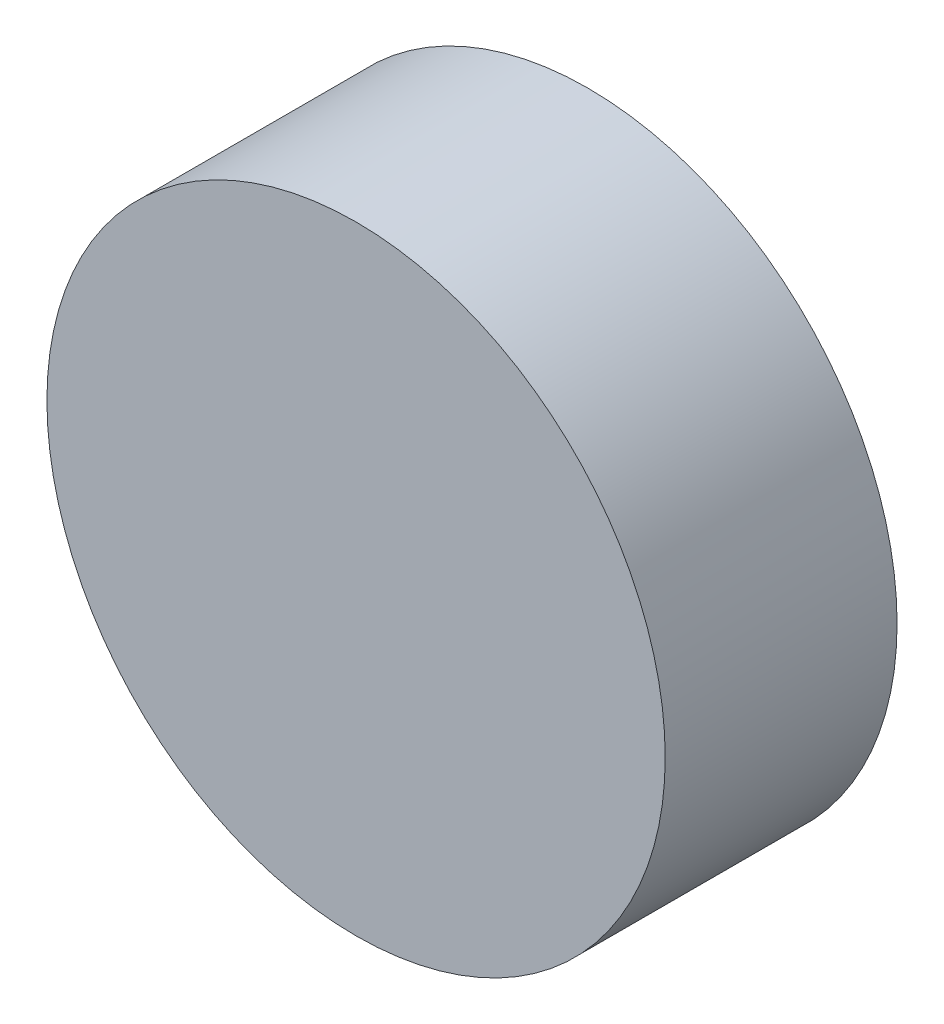
ISO-10303-21;
HEADER;
FILE_DESCRIPTION(('STEP AP214'),'2;1');
FILE_NAME('part.step','',(''),(''),'','','');
FILE_SCHEMA(('AUTOMOTIVE_DESIGN { 1 0 10303 214 1 1 1 1 }'));
ENDSEC;
DATA;
#1=APPLICATION_CONTEXT('core data for automotive mechanical design processes');
#2=APPLICATION_PROTOCOL_DEFINITION('international standard','automotive_design',2000,#1);
#3=PRODUCT_CONTEXT('',#1,'mechanical');
#4=PRODUCT('Part','Part','',(#3));
#5=PRODUCT_RELATED_PRODUCT_CATEGORY('part','',(#4));
#6=PRODUCT_DEFINITION_FORMATION('','',#4);
#7=PRODUCT_DEFINITION_CONTEXT('part definition',#1,'design');
#8=PRODUCT_DEFINITION('design','',#6,#7);
#9=PRODUCT_DEFINITION_SHAPE('','',#8);
#10=(LENGTH_UNIT() NAMED_UNIT(*) SI_UNIT(.MILLI.,.METRE.));
#11=(NAMED_UNIT(*) PLANE_ANGLE_UNIT() SI_UNIT($,.RADIAN.));
#12=(NAMED_UNIT(*) SI_UNIT($,.STERADIAN.) SOLID_ANGLE_UNIT());
#13=UNCERTAINTY_MEASURE_WITH_UNIT(LENGTH_MEASURE(1.E-05),#10,'distance_accuracy_value','');
#14=(GEOMETRIC_REPRESENTATION_CONTEXT(3) GLOBAL_UNCERTAINTY_ASSIGNED_CONTEXT((#13)) GLOBAL_UNIT_ASSIGNED_CONTEXT((#10,
#11,#12)) REPRESENTATION_CONTEXT('',''));
#15=CARTESIAN_POINT('',(0.,0.,0.));
#16=DIRECTION('',(0.,0.,1.));
#17=DIRECTION('',(1.,0.,0.));
#18=AXIS2_PLACEMENT_3D('',#15,#16,#17);
#19=CARTESIAN_POINT('',(0.,0.,10.5));
#20=DIRECTION('',(0.,0.,-1.));
#21=DIRECTION('',(-1.,0.,0.));
#22=AXIS2_PLACEMENT_3D('',#19,#20,#21);
#23=CYLINDRICAL_SURFACE('',#22,14.);
#24=CARTESIAN_POINT('',(0.,0.,10.5));
#25=DIRECTION('',(0.,0.,1.));
#26=DIRECTION('',(1.,0.,0.));
#27=AXIS2_PLACEMENT_3D('',#24,#25,#26);
#28=CIRCLE('',#27,14.);
#29=CARTESIAN_POINT('',(-14.,0.,10.5));
#30=VERTEX_POINT('',#29);
#31=EDGE_CURVE('E10',#30,#30,#28,.T.);
#32=CARTESIAN_POINT('',(0.,0.,0.));
#33=DIRECTION('',(0.,0.,1.));
#34=DIRECTION('',(1.,0.,0.));
#35=AXIS2_PLACEMENT_3D('',#32,#33,#34);
#36=CIRCLE('',#35,14.);
#37=CARTESIAN_POINT('',(-14.,0.,0.));
#38=VERTEX_POINT('',#37);
#39=EDGE_CURVE('E35',#38,#38,#36,.T.);
#40=CARTESIAN_POINT('',(-14.,0.,10.5));
#41=CARTESIAN_POINT('',(-14.,0.,10.390625));
#42=CARTESIAN_POINT('',(-14.,0.,10.28125));
#43=CARTESIAN_POINT('',(-14.,0.,10.0625));
#44=CARTESIAN_POINT('',(-14.,0.,9.953125));
#45=CARTESIAN_POINT('',(-14.,0.,9.734375));
#46=CARTESIAN_POINT('',(-14.,0.,9.625));
#47=CARTESIAN_POINT('',(-14.,0.,9.40625));
#48=CARTESIAN_POINT('',(-14.,0.,9.296875));
#49=CARTESIAN_POINT('',(-14.,0.,9.078125));
#50=CARTESIAN_POINT('',(-14.,0.,8.96875));
#51=CARTESIAN_POINT('',(-14.,0.,8.75));
#52=CARTESIAN_POINT('',(-14.,0.,8.640625));
#53=CARTESIAN_POINT('',(-14.,0.,8.421875));
#54=CARTESIAN_POINT('',(-14.,0.,8.3125));
#55=CARTESIAN_POINT('',(-14.,0.,8.09375));
#56=CARTESIAN_POINT('',(-14.,0.,7.984375));
#57=CARTESIAN_POINT('',(-14.,0.,7.765625));
#58=CARTESIAN_POINT('',(-14.,0.,7.65625));
#59=CARTESIAN_POINT('',(-14.,0.,7.4375));
#60=CARTESIAN_POINT('',(-14.,0.,7.328125));
#61=CARTESIAN_POINT('',(-14.,0.,7.109375));
#62=CARTESIAN_POINT('',(-14.,0.,7.));
#63=CARTESIAN_POINT('',(-14.,0.,6.78125));
#64=CARTESIAN_POINT('',(-14.,0.,6.671875));
#65=CARTESIAN_POINT('',(-14.,0.,6.453125));
#66=CARTESIAN_POINT('',(-14.,0.,6.34375));
#67=CARTESIAN_POINT('',(-14.,0.,6.125));
#68=CARTESIAN_POINT('',(-14.,0.,6.015625));
#69=CARTESIAN_POINT('',(-14.,0.,5.796875));
#70=CARTESIAN_POINT('',(-14.,0.,5.6875));
#71=CARTESIAN_POINT('',(-14.,0.,5.46875));
#72=CARTESIAN_POINT('',(-14.,0.,5.359375));
#73=CARTESIAN_POINT('',(-14.,0.,5.140625));
#74=CARTESIAN_POINT('',(-14.,0.,5.03125));
#75=CARTESIAN_POINT('',(-14.,0.,4.8125));
#76=CARTESIAN_POINT('',(-14.,0.,4.703125));
#77=CARTESIAN_POINT('',(-14.,0.,4.484375));
#78=CARTESIAN_POINT('',(-14.,0.,4.375));
#79=CARTESIAN_POINT('',(-14.,0.,4.15625));
#80=CARTESIAN_POINT('',(-14.,0.,4.046875));
#81=CARTESIAN_POINT('',(-14.,0.,3.828125));
#82=CARTESIAN_POINT('',(-14.,0.,3.71875));
#83=CARTESIAN_POINT('',(-14.,0.,3.5));
#84=CARTESIAN_POINT('',(-14.,0.,3.390625));
#85=CARTESIAN_POINT('',(-14.,0.,3.171875));
#86=CARTESIAN_POINT('',(-14.,0.,3.0625));
#87=CARTESIAN_POINT('',(-14.,0.,2.84375));
#88=CARTESIAN_POINT('',(-14.,0.,2.734375));
#89=CARTESIAN_POINT('',(-14.,0.,2.515625));
#90=CARTESIAN_POINT('',(-14.,0.,2.40625));
#91=CARTESIAN_POINT('',(-14.,0.,2.1875));
#92=CARTESIAN_POINT('',(-14.,0.,2.078125));
#93=CARTESIAN_POINT('',(-14.,0.,1.859375));
#94=CARTESIAN_POINT('',(-14.,0.,1.75));
#95=CARTESIAN_POINT('',(-14.,0.,1.53125));
#96=CARTESIAN_POINT('',(-14.,0.,1.421875));
#97=CARTESIAN_POINT('',(-14.,0.,1.203125));
#98=CARTESIAN_POINT('',(-14.,0.,1.09375));
#99=CARTESIAN_POINT('',(-14.,0.,0.875000000000001));
#100=CARTESIAN_POINT('',(-14.,0.,0.765625000000001));
#101=CARTESIAN_POINT('',(-14.,0.,0.546875));
#102=CARTESIAN_POINT('',(-14.,0.,0.4375));
#103=CARTESIAN_POINT('',(-14.,0.,0.21875));
#104=CARTESIAN_POINT('',(-14.,0.,0.109375));
#105=CARTESIAN_POINT('',(-14.,0.,0.));
#106=B_SPLINE_CURVE_WITH_KNOTS('',3,(#40,#41,#42,#43,#44,#45,#46,#47,#48,#49,#50,#51,#52,#53,
#54,#55,#56,#57,#58,#59,#60,#61,#62,#63,#64,#65,#66,#67,#68,#69,#70,#71,#72,#73,#74,#75,#76,#77,
#78,#79,#80,#81,#82,#83,#84,#85,#86,#87,#88,#89,#90,#91,#92,#93,#94,#95,#96,#97,#98,#99,#100,
#101,#102,#103,#104,#105),.UNSPECIFIED.,.F.,.F.,(4,2,2,2,2,2,2,2,2,2,2,2,2,2,2,2,2,2,2,2,2,2,2,
2,2,2,2,2,2,2,2,2,4),(0.,0.328125,0.656250000000001,0.984375000000001,1.3125,1.640625,1.96875,
2.296875,2.625,2.953125,3.28125,3.609375,3.9375,4.265625,4.59375,4.921875,5.25,5.578125,5.90625,
6.234375,6.5625,6.890625,7.21875,7.546875,7.875,8.203125,8.53125,8.859375,9.1875,9.515625,
9.84375,10.171875,10.5),.UNSPECIFIED.);
#107=EDGE_CURVE('BSEAM32',#30,#38,#106,.T.);
#108=ORIENTED_EDGE('',*,*,#31,.F.);
#109=ORIENTED_EDGE('',*,*,#39,.T.);
#110=ORIENTED_EDGE('',*,*,#107,.T.);
#111=ORIENTED_EDGE('',*,*,#107,.F.);
#112=EDGE_LOOP('',(#108,#110,#109,#111));
#113=FACE_BOUND('',#112,.T.);
#114=ADVANCED_FACE('F32',(#113),#23,.T.);
#115=CARTESIAN_POINT('',(0.,0.,10.5));
#116=DIRECTION('',(0.,0.,1.));
#117=DIRECTION('',(1.,0.,0.));
#118=AXIS2_PLACEMENT_3D('',#115,#116,#117);
#119=PLANE('',#118);
#120=ORIENTED_EDGE('',*,*,#31,.T.);
#121=EDGE_LOOP('',(#120));
#122=FACE_BOUND('',#121,.T.);
#123=ADVANCED_FACE('F47',(#122),#119,.T.);
#124=CARTESIAN_POINT('',(0.,0.,0.));
#125=DIRECTION('',(0.,0.,1.));
#126=DIRECTION('',(1.,0.,0.));
#127=AXIS2_PLACEMENT_3D('',#124,#125,#126);
#128=PLANE('',#127);
#129=ORIENTED_EDGE('',*,*,#39,.F.);
#130=EDGE_LOOP('',(#129));
#131=FACE_BOUND('',#130,.T.);
#132=ADVANCED_FACE('F45',(#131),#128,.F.);
#133=CLOSED_SHELL('',(#114,#123,#132));
#134=MANIFOLD_SOLID_BREP('B2',#133);
#135=ADVANCED_BREP_SHAPE_REPRESENTATION('',(#18,#134),#14);
#136=SHAPE_DEFINITION_REPRESENTATION(#9,#135);
ENDSEC;
END-ISO-10303-21;
